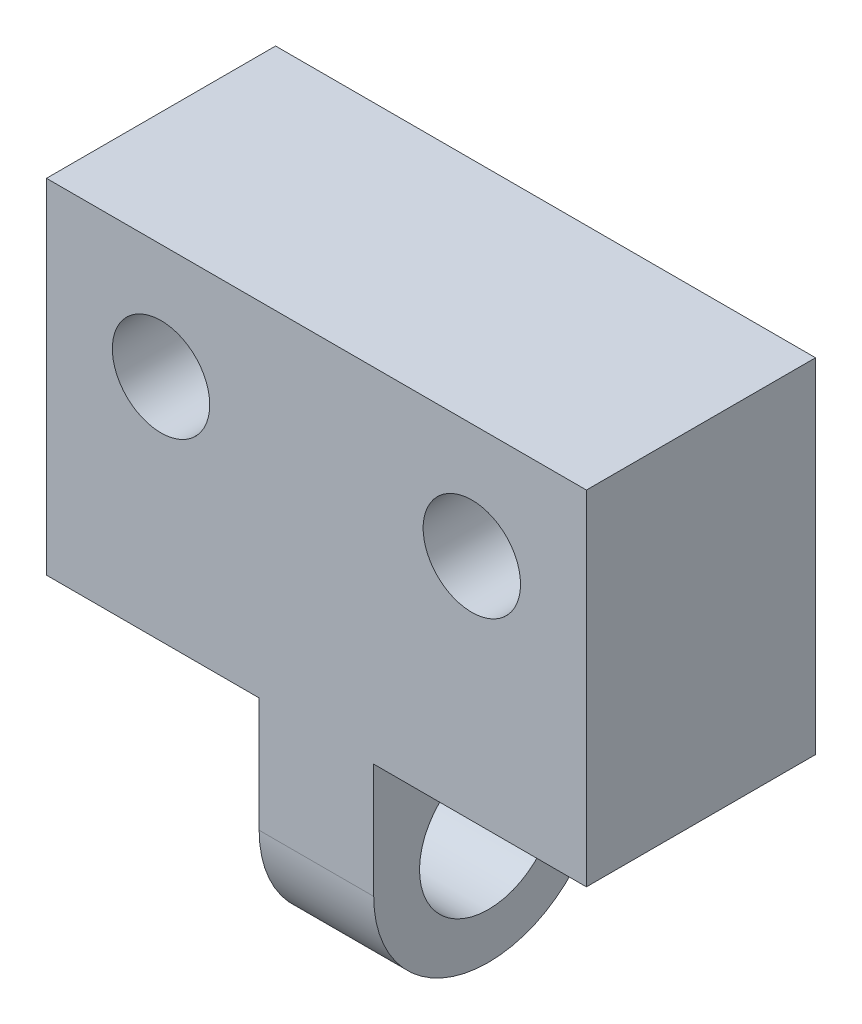
ISO-10303-21;
HEADER;
FILE_DESCRIPTION(('STEP AP214'),'2;1');
FILE_NAME('part.step','',(''),(''),'','','');
FILE_SCHEMA(('AUTOMOTIVE_DESIGN { 1 0 10303 214 1 1 1 1 }'));
ENDSEC;
DATA;
#1=APPLICATION_CONTEXT('core data for automotive mechanical design processes');
#2=APPLICATION_PROTOCOL_DEFINITION('international standard','automotive_design',2000,#1);
#3=PRODUCT_CONTEXT('',#1,'mechanical');
#4=PRODUCT('Part','Part','',(#3));
#5=PRODUCT_RELATED_PRODUCT_CATEGORY('part','',(#4));
#6=PRODUCT_DEFINITION_FORMATION('','',#4);
#7=PRODUCT_DEFINITION_CONTEXT('part definition',#1,'design');
#8=PRODUCT_DEFINITION('design','',#6,#7);
#9=PRODUCT_DEFINITION_SHAPE('','',#8);
#10=(LENGTH_UNIT() NAMED_UNIT(*) SI_UNIT(.MILLI.,.METRE.));
#11=(NAMED_UNIT(*) PLANE_ANGLE_UNIT() SI_UNIT($,.RADIAN.));
#12=(NAMED_UNIT(*) SI_UNIT($,.STERADIAN.) SOLID_ANGLE_UNIT());
#13=UNCERTAINTY_MEASURE_WITH_UNIT(LENGTH_MEASURE(1.E-05),#10,'distance_accuracy_value','');
#14=(GEOMETRIC_REPRESENTATION_CONTEXT(3) GLOBAL_UNCERTAINTY_ASSIGNED_CONTEXT((#13)) GLOBAL_UNIT_ASSIGNED_CONTEXT((#10,
#11,#12)) REPRESENTATION_CONTEXT('',''));
#15=CARTESIAN_POINT('',(0.,0.,0.));
#16=DIRECTION('',(0.,0.,1.));
#17=DIRECTION('',(1.,0.,0.));
#18=AXIS2_PLACEMENT_3D('',#15,#16,#17);
#19=CARTESIAN_POINT('',(47.1297055354398,12.1574605848309,20.));
#20=DIRECTION('',(-1.,0.,0.));
#21=DIRECTION('',(0.,0.,1.));
#22=AXIS2_PLACEMENT_3D('',#19,#20,#21);
#23=PLANE('',#22);
#24=DIRECTION('',(0.,1.,0.));
#25=VECTOR('',#24,1.);
#26=CARTESIAN_POINT('',(47.1297055354398,12.1574605848309,0.));
#27=LINE('',#26,#25);
#28=CARTESIAN_POINT('',(47.1297055354398,12.1574605848309,0.));
#29=VERTEX_POINT('',#28);
#30=CARTESIAN_POINT('',(47.1297055354398,42.1574605848309,0.));
#31=VERTEX_POINT('',#30);
#32=EDGE_CURVE('E127',#29,#31,#27,.T.);
#33=ORIENTED_EDGE('',*,*,#32,.T.);
#34=DIRECTION('',(0.,0.,-1.));
#35=VECTOR('',#34,1.);
#36=CARTESIAN_POINT('',(47.1297055354398,42.1574605848309,20.));
#37=LINE('',#36,#35);
#38=CARTESIAN_POINT('',(47.1297055354398,42.1574605848309,20.));
#39=VERTEX_POINT('',#38);
#40=EDGE_CURVE('E107',#39,#31,#37,.T.);
#41=ORIENTED_EDGE('',*,*,#40,.F.);
#42=DIRECTION('',(0.,1.,0.));
#43=VECTOR('',#42,1.);
#44=CARTESIAN_POINT('',(47.1297055354398,12.1574605848309,20.));
#45=LINE('',#44,#43);
#46=CARTESIAN_POINT('',(47.1297055354398,12.1574605848309,20.));
#47=VERTEX_POINT('',#46);
#48=EDGE_CURVE('E114',#47,#39,#45,.T.);
#49=ORIENTED_EDGE('',*,*,#48,.F.);
#50=DIRECTION('',(0.,0.,-1.));
#51=VECTOR('',#50,1.);
#52=CARTESIAN_POINT('',(47.1297055354398,12.1574605848309,20.));
#53=LINE('',#52,#51);
#54=EDGE_CURVE('E186',#47,#29,#53,.T.);
#55=ORIENTED_EDGE('',*,*,#54,.T.);
#56=EDGE_LOOP('',(#33,#41,#49,#55));
#57=FACE_BOUND('',#56,.T.);
#58=ADVANCED_FACE('F31',(#57),#23,.F.);
#59=CARTESIAN_POINT('',(0.,42.1574605848309,20.));
#60=DIRECTION('',(0.,-1.,0.));
#61=DIRECTION('',(0.,0.,-1.));
#62=AXIS2_PLACEMENT_3D('',#59,#60,#61);
#63=PLANE('',#62);
#64=DIRECTION('',(-1.,0.,0.));
#65=VECTOR('',#64,1.);
#66=CARTESIAN_POINT('',(0.,42.1574605848309,0.));
#67=LINE('',#66,#65);
#68=CARTESIAN_POINT('',(0.,42.1574605848309,0.));
#69=VERTEX_POINT('',#68);
#70=EDGE_CURVE('E188',#31,#69,#67,.T.);
#71=ORIENTED_EDGE('',*,*,#70,.T.);
#72=DIRECTION('',(0.,0.,-1.));
#73=VECTOR('',#72,1.);
#74=CARTESIAN_POINT('',(0.,42.1574605848309,20.));
#75=LINE('',#74,#73);
#76=CARTESIAN_POINT('',(0.,42.1574605848309,20.));
#77=VERTEX_POINT('',#76);
#78=EDGE_CURVE('E110',#77,#69,#75,.T.);
#79=ORIENTED_EDGE('',*,*,#78,.F.);
#80=DIRECTION('',(-1.,0.,0.));
#81=VECTOR('',#80,1.);
#82=CARTESIAN_POINT('',(0.,42.1574605848309,20.));
#83=LINE('',#82,#81);
#84=EDGE_CURVE('E103',#39,#77,#83,.T.);
#85=ORIENTED_EDGE('',*,*,#84,.F.);
#86=ORIENTED_EDGE('',*,*,#40,.T.);
#87=EDGE_LOOP('',(#71,#79,#85,#86));
#88=FACE_BOUND('',#87,.T.);
#89=ADVANCED_FACE('F105',(#88),#63,.F.);
#90=CARTESIAN_POINT('',(0.,12.1574605848309,20.));
#91=DIRECTION('',(1.,0.,0.));
#92=DIRECTION('',(0.,0.,-1.));
#93=AXIS2_PLACEMENT_3D('',#90,#91,#92);
#94=PLANE('',#93);
#95=DIRECTION('',(0.,-1.,0.));
#96=VECTOR('',#95,1.);
#97=CARTESIAN_POINT('',(0.,12.1574605848309,0.));
#98=LINE('',#97,#96);
#99=CARTESIAN_POINT('',(0.,12.1574605848309,0.));
#100=VERTEX_POINT('',#99);
#101=EDGE_CURVE('E190',#69,#100,#98,.T.);
#102=ORIENTED_EDGE('',*,*,#101,.T.);
#103=DIRECTION('',(0.,0.,-1.));
#104=VECTOR('',#103,1.);
#105=CARTESIAN_POINT('',(0.,12.1574605848309,20.));
#106=LINE('',#105,#104);
#107=CARTESIAN_POINT('',(0.,12.1574605848309,20.));
#108=VERTEX_POINT('',#107);
#109=EDGE_CURVE('E133',#108,#100,#106,.T.);
#110=ORIENTED_EDGE('',*,*,#109,.F.);
#111=DIRECTION('',(0.,-1.,0.));
#112=VECTOR('',#111,1.);
#113=CARTESIAN_POINT('',(0.,12.1574605848309,20.));
#114=LINE('',#113,#112);
#115=EDGE_CURVE('E113',#77,#108,#114,.T.);
#116=ORIENTED_EDGE('',*,*,#115,.F.);
#117=ORIENTED_EDGE('',*,*,#78,.T.);
#118=EDGE_LOOP('',(#102,#110,#116,#117));
#119=FACE_BOUND('',#118,.T.);
#120=ADVANCED_FACE('F212',(#119),#94,.F.);
#121=CARTESIAN_POINT('',(0.,12.1574605848309,20.));
#122=DIRECTION('',(0.,1.,0.));
#123=DIRECTION('',(-1.,0.,0.));
#124=AXIS2_PLACEMENT_3D('',#121,#122,#123);
#125=PLANE('',#124);
#126=DIRECTION('',(1.,0.,0.));
#127=VECTOR('',#126,1.);
#128=CARTESIAN_POINT('',(0.,12.1574605848309,0.));
#129=LINE('',#128,#127);
#130=CARTESIAN_POINT('',(18.5648527677199,12.1574605848309,0.));
#131=VERTEX_POINT('',#130);
#132=EDGE_CURVE('E192',#100,#131,#129,.T.);
#133=ORIENTED_EDGE('',*,*,#132,.T.);
#134=DIRECTION('',(0.,0.,-1.));
#135=VECTOR('',#134,1.);
#136=CARTESIAN_POINT('',(18.5648527677199,12.1574605848309,20.));
#137=LINE('',#136,#135);
#138=CARTESIAN_POINT('',(18.5648527677199,12.1574605848309,20.));
#139=VERTEX_POINT('',#138);
#140=EDGE_CURVE('E203',#139,#131,#137,.T.);
#141=ORIENTED_EDGE('',*,*,#140,.F.);
#142=DIRECTION('',(1.,0.,0.));
#143=VECTOR('',#142,1.);
#144=CARTESIAN_POINT('',(0.,12.1574605848309,20.));
#145=LINE('',#144,#143);
#146=EDGE_CURVE('E156',#108,#139,#145,.T.);
#147=ORIENTED_EDGE('',*,*,#146,.F.);
#148=ORIENTED_EDGE('',*,*,#109,.T.);
#149=EDGE_LOOP('',(#133,#141,#147,#148));
#150=FACE_BOUND('',#149,.T.);
#151=ADVANCED_FACE('F208',(#150),#125,.F.);
#152=CARTESIAN_POINT('',(18.5648527677199,12.1574605848309,20.));
#153=DIRECTION('',(1.,0.,0.));
#154=DIRECTION('',(0.,1.,0.));
#155=AXIS2_PLACEMENT_3D('',#152,#153,#154);
#156=PLANE('',#155);
#157=CARTESIAN_POINT('',(18.5648527677199,2.15746058483092,10.));
#158=DIRECTION('',(1.,0.,0.));
#159=DIRECTION('',(0.,1.,0.));
#160=AXIS2_PLACEMENT_3D('',#157,#158,#159);
#161=CIRCLE('',#160,5.99999999999999);
#162=CARTESIAN_POINT('',(18.5648527677199,8.15746058483091,10.));
#163=VERTEX_POINT('',#162);
#164=EDGE_CURVE('E139',#163,#163,#161,.T.);
#165=ORIENTED_EDGE('',*,*,#164,.T.);
#166=EDGE_LOOP('',(#165));
#167=FACE_BOUND('',#166,.T.);
#168=CARTESIAN_POINT('',(18.5648527677199,2.15746058483091,10.));
#169=DIRECTION('',(1.,0.,0.));
#170=DIRECTION('',(0.,1.,0.));
#171=AXIS2_PLACEMENT_3D('',#168,#169,#170);
#172=CIRCLE('',#171,10.);
#173=CARTESIAN_POINT('',(18.5648527677199,2.15746058483091,0.));
#174=VERTEX_POINT('',#173);
#175=CARTESIAN_POINT('',(18.5648527677199,-7.84253941516909,10.));
#176=VERTEX_POINT('',#175);
#177=EDGE_CURVE('E47',#174,#176,#172,.F.);
#178=ORIENTED_EDGE('',*,*,#177,.T.);
#179=CARTESIAN_POINT('',(18.5648527677199,2.15746058483091,10.));
#180=DIRECTION('',(1.,0.,0.));
#181=DIRECTION('',(0.,1.,0.));
#182=AXIS2_PLACEMENT_3D('',#179,#180,#181);
#183=CIRCLE('',#182,10.);
#184=CARTESIAN_POINT('',(18.5648527677199,2.15746058483091,20.));
#185=VERTEX_POINT('',#184);
#186=EDGE_CURVE('E40',#176,#185,#183,.F.);
#187=ORIENTED_EDGE('',*,*,#186,.T.);
#188=DIRECTION('',(0.,-1.,0.));
#189=VECTOR('',#188,1.);
#190=CARTESIAN_POINT('',(18.5648527677199,12.1574605848309,20.));
#191=LINE('',#190,#189);
#192=EDGE_CURVE('E150',#139,#185,#191,.T.);
#193=ORIENTED_EDGE('',*,*,#192,.F.);
#194=ORIENTED_EDGE('',*,*,#140,.T.);
#195=DIRECTION('',(0.,-1.,0.));
#196=VECTOR('',#195,1.);
#197=CARTESIAN_POINT('',(18.5648527677199,12.1574605848309,0.));
#198=LINE('',#197,#196);
#199=EDGE_CURVE('E194',#131,#174,#198,.T.);
#200=ORIENTED_EDGE('',*,*,#199,.T.);
#201=EDGE_LOOP('',(#178,#187,#193,#194,#200));
#202=FACE_BOUND('',#201,.T.);
#203=ADVANCED_FACE('F148',(#167,#202),#156,.F.);
#204=CARTESIAN_POINT('',(28.5648527677199,12.1574605848309,20.));
#205=DIRECTION('',(-1.,0.,0.));
#206=DIRECTION('',(0.,-1.,0.));
#207=AXIS2_PLACEMENT_3D('',#204,#205,#206);
#208=PLANE('',#207);
#209=CARTESIAN_POINT('',(28.5648527677199,2.15746058483092,10.));
#210=DIRECTION('',(-1.,0.,0.));
#211=DIRECTION('',(0.,-1.,0.));
#212=AXIS2_PLACEMENT_3D('',#209,#210,#211);
#213=CIRCLE('',#212,5.99999999999999);
#214=CARTESIAN_POINT('',(28.5648527677199,-3.84253941516907,10.));
#215=VERTEX_POINT('',#214);
#216=EDGE_CURVE('E137',#215,#215,#213,.T.);
#217=ORIENTED_EDGE('',*,*,#216,.T.);
#218=EDGE_LOOP('',(#217));
#219=FACE_BOUND('',#218,.T.);
#220=DIRECTION('',(0.,1.,0.));
#221=VECTOR('',#220,1.);
#222=CARTESIAN_POINT('',(28.5648527677199,12.1574605848309,20.));
#223=LINE('',#222,#221);
#224=CARTESIAN_POINT('',(28.5648527677199,2.15746058483091,20.));
#225=VERTEX_POINT('',#224);
#226=CARTESIAN_POINT('',(28.5648527677199,12.1574605848309,20.));
#227=VERTEX_POINT('',#226);
#228=EDGE_CURVE('E158',#225,#227,#223,.T.);
#229=ORIENTED_EDGE('',*,*,#228,.F.);
#230=CARTESIAN_POINT('',(28.5648527677199,2.15746058483091,10.));
#231=DIRECTION('',(-1.,0.,0.));
#232=DIRECTION('',(0.,-1.,0.));
#233=AXIS2_PLACEMENT_3D('',#230,#231,#232);
#234=CIRCLE('',#233,10.);
#235=CARTESIAN_POINT('',(28.5648527677199,-7.84253941516909,10.));
#236=VERTEX_POINT('',#235);
#237=EDGE_CURVE('E143',#225,#236,#234,.F.);
#238=ORIENTED_EDGE('',*,*,#237,.T.);
#239=CARTESIAN_POINT('',(28.5648527677199,2.15746058483091,10.));
#240=DIRECTION('',(-1.,0.,0.));
#241=DIRECTION('',(0.,-1.,0.));
#242=AXIS2_PLACEMENT_3D('',#239,#240,#241);
#243=CIRCLE('',#242,10.);
#244=CARTESIAN_POINT('',(28.5648527677199,2.15746058483091,0.));
#245=VERTEX_POINT('',#244);
#246=EDGE_CURVE('E131',#236,#245,#243,.F.);
#247=ORIENTED_EDGE('',*,*,#246,.T.);
#248=DIRECTION('',(0.,1.,0.));
#249=VECTOR('',#248,1.);
#250=CARTESIAN_POINT('',(28.5648527677199,12.1574605848309,0.));
#251=LINE('',#250,#249);
#252=CARTESIAN_POINT('',(28.5648527677199,12.1574605848309,0.));
#253=VERTEX_POINT('',#252);
#254=EDGE_CURVE('E196',#245,#253,#251,.T.);
#255=ORIENTED_EDGE('',*,*,#254,.T.);
#256=DIRECTION('',(0.,0.,-1.));
#257=VECTOR('',#256,1.);
#258=CARTESIAN_POINT('',(28.5648527677199,12.1574605848309,20.));
#259=LINE('',#258,#257);
#260=EDGE_CURVE('E200',#227,#253,#259,.T.);
#261=ORIENTED_EDGE('',*,*,#260,.F.);
#262=EDGE_LOOP('',(#229,#238,#247,#255,#261));
#263=FACE_BOUND('',#262,.T.);
#264=ADVANCED_FACE('F163',(#219,#263),#208,.F.);
#265=CARTESIAN_POINT('',(47.1297055354398,12.1574605848309,20.));
#266=DIRECTION('',(0.,1.,0.));
#267=DIRECTION('',(0.,0.,1.));
#268=AXIS2_PLACEMENT_3D('',#265,#266,#267);
#269=PLANE('',#268);
#270=DIRECTION('',(1.,0.,0.));
#271=VECTOR('',#270,1.);
#272=CARTESIAN_POINT('',(47.1297055354398,12.1574605848309,0.));
#273=LINE('',#272,#271);
#274=EDGE_CURVE('E124',#253,#29,#273,.T.);
#275=ORIENTED_EDGE('',*,*,#274,.T.);
#276=ORIENTED_EDGE('',*,*,#54,.F.);
#277=DIRECTION('',(1.,0.,0.));
#278=VECTOR('',#277,1.);
#279=CARTESIAN_POINT('',(47.1297055354398,12.1574605848309,20.));
#280=LINE('',#279,#278);
#281=EDGE_CURVE('E120',#227,#47,#280,.T.);
#282=ORIENTED_EDGE('',*,*,#281,.F.);
#283=ORIENTED_EDGE('',*,*,#260,.T.);
#284=EDGE_LOOP('',(#275,#276,#282,#283));
#285=FACE_BOUND('',#284,.T.);
#286=ADVANCED_FACE('F249',(#285),#269,.F.);
#287=CARTESIAN_POINT('',(47.1297055354398,42.1574605848309,20.));
#288=DIRECTION('',(0.,0.,-1.));
#289=DIRECTION('',(-1.,0.,0.));
#290=AXIS2_PLACEMENT_3D('',#287,#288,#289);
#291=PLANE('',#290);
#292=CARTESIAN_POINT('',(37.1297055354398,32.1574605848309,20.));
#293=DIRECTION('',(0.,0.,1.));
#294=DIRECTION('',(1.,0.,0.));
#295=AXIS2_PLACEMENT_3D('',#292,#293,#294);
#296=CIRCLE('',#295,4.24999999999999);
#297=CARTESIAN_POINT('',(41.3797055354398,32.1574605848309,20.));
#298=VERTEX_POINT('',#297);
#299=EDGE_CURVE('E166',#298,#298,#296,.T.);
#300=ORIENTED_EDGE('',*,*,#299,.F.);
#301=EDGE_LOOP('',(#300));
#302=FACE_BOUND('',#301,.T.);
#303=CARTESIAN_POINT('',(10.,32.1574605848309,20.));
#304=DIRECTION('',(0.,0.,1.));
#305=DIRECTION('',(1.,0.,0.));
#306=AXIS2_PLACEMENT_3D('',#303,#304,#305);
#307=CIRCLE('',#306,4.24999999999999);
#308=CARTESIAN_POINT('',(14.25,32.1574605848309,20.));
#309=VERTEX_POINT('',#308);
#310=EDGE_CURVE('E173',#309,#309,#307,.T.);
#311=ORIENTED_EDGE('',*,*,#310,.F.);
#312=EDGE_LOOP('',(#311));
#313=FACE_BOUND('',#312,.T.);
#314=ORIENTED_EDGE('',*,*,#192,.T.);
#315=DIRECTION('',(1.,0.,0.));
#316=VECTOR('',#315,1.);
#317=CARTESIAN_POINT('',(47.1297055354398,2.15746058483091,20.));
#318=LINE('',#317,#316);
#319=EDGE_CURVE('E128',#185,#225,#318,.T.);
#320=ORIENTED_EDGE('',*,*,#319,.T.);
#321=ORIENTED_EDGE('',*,*,#228,.T.);
#322=ORIENTED_EDGE('',*,*,#281,.T.);
#323=ORIENTED_EDGE('',*,*,#48,.T.);
#324=ORIENTED_EDGE('',*,*,#84,.T.);
#325=ORIENTED_EDGE('',*,*,#115,.T.);
#326=ORIENTED_EDGE('',*,*,#146,.T.);
#327=EDGE_LOOP('',(#314,#320,#321,#322,#323,#324,#325,#326));
#328=FACE_BOUND('',#327,.T.);
#329=ADVANCED_FACE('F118',(#302,#313,#328),#291,.F.);
#330=CARTESIAN_POINT('',(47.1297055354398,42.1574605848309,0.));
#331=DIRECTION('',(0.,0.,-1.));
#332=DIRECTION('',(-1.,0.,0.));
#333=AXIS2_PLACEMENT_3D('',#330,#331,#332);
#334=PLANE('',#333);
#335=CARTESIAN_POINT('',(37.1297055354398,32.1574605848309,0.));
#336=DIRECTION('',(0.,0.,1.));
#337=DIRECTION('',(1.,0.,0.));
#338=AXIS2_PLACEMENT_3D('',#335,#336,#337);
#339=CIRCLE('',#338,4.25);
#340=CARTESIAN_POINT('',(41.3797055354398,32.1574605848309,0.));
#341=VERTEX_POINT('',#340);
#342=EDGE_CURVE('E168',#341,#341,#339,.T.);
#343=ORIENTED_EDGE('',*,*,#342,.T.);
#344=EDGE_LOOP('',(#343));
#345=FACE_BOUND('',#344,.T.);
#346=CARTESIAN_POINT('',(10.,32.1574605848309,0.));
#347=DIRECTION('',(0.,0.,1.));
#348=DIRECTION('',(1.,0.,0.));
#349=AXIS2_PLACEMENT_3D('',#346,#347,#348);
#350=CIRCLE('',#349,4.24999999999999);
#351=CARTESIAN_POINT('',(14.25,32.1574605848309,0.));
#352=VERTEX_POINT('',#351);
#353=EDGE_CURVE('E140',#352,#352,#350,.T.);
#354=ORIENTED_EDGE('',*,*,#353,.T.);
#355=EDGE_LOOP('',(#354));
#356=FACE_BOUND('',#355,.T.);
#357=ORIENTED_EDGE('',*,*,#254,.F.);
#358=DIRECTION('',(1.,0.,0.));
#359=VECTOR('',#358,1.);
#360=CARTESIAN_POINT('',(18.5648527677199,2.15746058483091,0.));
#361=LINE('',#360,#359);
#362=EDGE_CURVE('E11',#245,#174,#361,.F.);
#363=ORIENTED_EDGE('',*,*,#362,.T.);
#364=ORIENTED_EDGE('',*,*,#199,.F.);
#365=ORIENTED_EDGE('',*,*,#132,.F.);
#366=ORIENTED_EDGE('',*,*,#101,.F.);
#367=ORIENTED_EDGE('',*,*,#70,.F.);
#368=ORIENTED_EDGE('',*,*,#32,.F.);
#369=ORIENTED_EDGE('',*,*,#274,.F.);
#370=EDGE_LOOP('',(#357,#363,#364,#365,#366,#367,#368,#369));
#371=FACE_BOUND('',#370,.T.);
#372=ADVANCED_FACE('F211',(#345,#356,#371),#334,.T.);
#373=CARTESIAN_POINT('',(47.1297055354398,2.15746058483092,10.));
#374=DIRECTION('',(1.,0.,0.));
#375=DIRECTION('',(0.,0.,-1.));
#376=AXIS2_PLACEMENT_3D('',#373,#374,#375);
#377=CYLINDRICAL_SURFACE('',#376,5.99999999999999);
#378=ORIENTED_EDGE('',*,*,#216,.F.);
#379=EDGE_LOOP('',(#378));
#380=FACE_BOUND('',#379,.T.);
#381=ORIENTED_EDGE('',*,*,#164,.F.);
#382=EDGE_LOOP('',(#381));
#383=FACE_BOUND('',#382,.T.);
#384=ADVANCED_FACE('F239',(#380,#383),#377,.F.);
#385=CARTESIAN_POINT('',(10.,32.1574605848309,20.));
#386=DIRECTION('',(0.,0.,1.));
#387=DIRECTION('',(1.,0.,0.));
#388=AXIS2_PLACEMENT_3D('',#385,#386,#387);
#389=CYLINDRICAL_SURFACE('',#388,4.24999999999999);
#390=ORIENTED_EDGE('',*,*,#353,.F.);
#391=EDGE_LOOP('',(#390));
#392=FACE_BOUND('',#391,.T.);
#393=ORIENTED_EDGE('',*,*,#310,.T.);
#394=EDGE_LOOP('',(#393));
#395=FACE_BOUND('',#394,.T.);
#396=ADVANCED_FACE('F233',(#392,#395),#389,.F.);
#397=CARTESIAN_POINT('',(37.1297055354398,32.1574605848309,20.));
#398=DIRECTION('',(0.,0.,1.));
#399=DIRECTION('',(1.,0.,0.));
#400=AXIS2_PLACEMENT_3D('',#397,#398,#399);
#401=CYLINDRICAL_SURFACE('',#400,4.24999999999999);
#402=ORIENTED_EDGE('',*,*,#342,.F.);
#403=EDGE_LOOP('',(#402));
#404=FACE_BOUND('',#403,.T.);
#405=ORIENTED_EDGE('',*,*,#299,.T.);
#406=EDGE_LOOP('',(#405));
#407=FACE_BOUND('',#406,.T.);
#408=ADVANCED_FACE('F229',(#404,#407),#401,.F.);
#409=CARTESIAN_POINT('',(18.5648527677199,2.15746058483091,10.));
#410=DIRECTION('',(-1.,0.,0.));
#411=DIRECTION('',(0.,-1.,0.));
#412=AXIS2_PLACEMENT_3D('',#409,#410,#411);
#413=CYLINDRICAL_SURFACE('',#412,10.);
#414=DIRECTION('',(1.,0.,0.));
#415=VECTOR('',#414,1.);
#416=CARTESIAN_POINT('',(28.5648527677199,-7.84253941516909,10.));
#417=LINE('',#416,#415);
#418=EDGE_CURVE('E35',#176,#236,#417,.T.);
#419=ORIENTED_EDGE('',*,*,#418,.F.);
#420=ORIENTED_EDGE('',*,*,#177,.F.);
#421=ORIENTED_EDGE('',*,*,#362,.F.);
#422=ORIENTED_EDGE('',*,*,#246,.F.);
#423=EDGE_LOOP('',(#419,#420,#421,#422));
#424=FACE_BOUND('',#423,.T.);
#425=ADVANCED_FACE('F33',(#424),#413,.T.);
#426=CARTESIAN_POINT('',(47.1297055354398,2.15746058483091,10.));
#427=DIRECTION('',(1.,0.,0.));
#428=DIRECTION('',(0.,1.,0.));
#429=AXIS2_PLACEMENT_3D('',#426,#427,#428);
#430=CYLINDRICAL_SURFACE('',#429,10.);
#431=ORIENTED_EDGE('',*,*,#186,.F.);
#432=ORIENTED_EDGE('',*,*,#418,.T.);
#433=ORIENTED_EDGE('',*,*,#237,.F.);
#434=ORIENTED_EDGE('',*,*,#319,.F.);
#435=EDGE_LOOP('',(#431,#432,#433,#434));
#436=FACE_BOUND('',#435,.T.);
#437=ADVANCED_FACE('F160',(#436),#430,.T.);
#438=CLOSED_SHELL('',(#58,#89,#120,#151,#203,#264,#286,#329,#372,#384,#396,#408,#425,#437));
#439=MANIFOLD_SOLID_BREP('B2',#438);
#440=ADVANCED_BREP_SHAPE_REPRESENTATION('',(#18,#439),#14);
#441=SHAPE_DEFINITION_REPRESENTATION(#9,#440);
ENDSEC;
END-ISO-10303-21;
